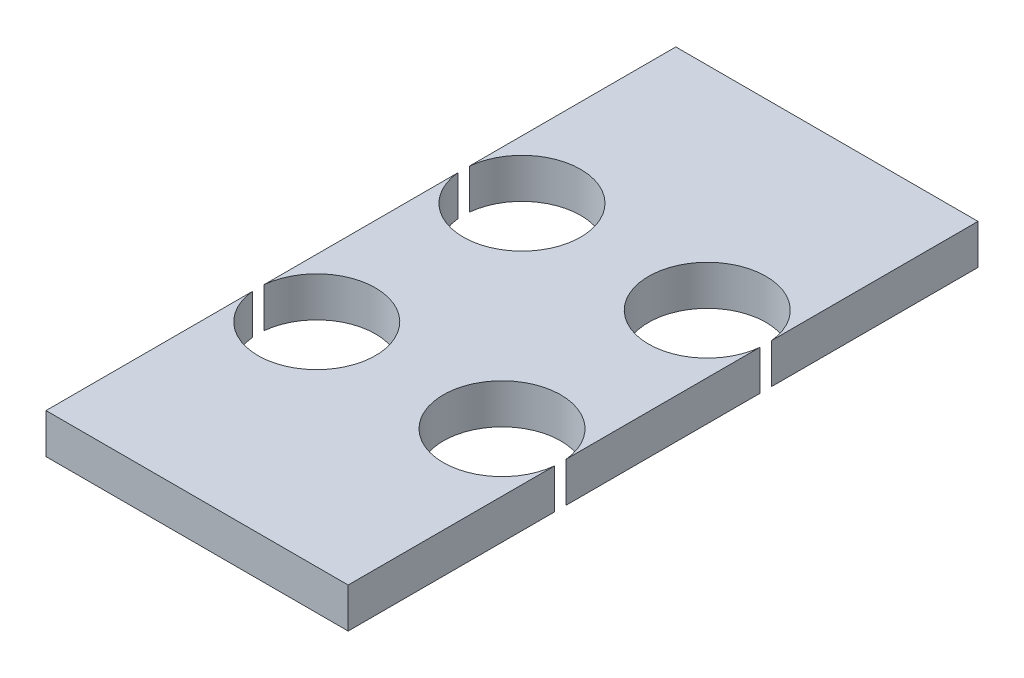
ISO-10303-21;
HEADER;
FILE_DESCRIPTION(('STEP AP214'),'2;1');
FILE_NAME('part.step','',(''),(''),'','','');
FILE_SCHEMA(('AUTOMOTIVE_DESIGN { 1 0 10303 214 1 1 1 1 }'));
ENDSEC;
DATA;
#1=APPLICATION_CONTEXT('core data for automotive mechanical design processes');
#2=APPLICATION_PROTOCOL_DEFINITION('international standard','automotive_design',2000,#1);
#3=PRODUCT_CONTEXT('',#1,'mechanical');
#4=PRODUCT('Part','Part','',(#3));
#5=PRODUCT_RELATED_PRODUCT_CATEGORY('part','',(#4));
#6=PRODUCT_DEFINITION_FORMATION('','',#4);
#7=PRODUCT_DEFINITION_CONTEXT('part definition',#1,'design');
#8=PRODUCT_DEFINITION('design','',#6,#7);
#9=PRODUCT_DEFINITION_SHAPE('','',#8);
#10=(LENGTH_UNIT() NAMED_UNIT(*) SI_UNIT(.MILLI.,.METRE.));
#11=(NAMED_UNIT(*) PLANE_ANGLE_UNIT() SI_UNIT($,.RADIAN.));
#12=(NAMED_UNIT(*) SI_UNIT($,.STERADIAN.) SOLID_ANGLE_UNIT());
#13=UNCERTAINTY_MEASURE_WITH_UNIT(LENGTH_MEASURE(1.E-05),#10,'distance_accuracy_value','');
#14=(GEOMETRIC_REPRESENTATION_CONTEXT(3) GLOBAL_UNCERTAINTY_ASSIGNED_CONTEXT((#13)) GLOBAL_UNIT_ASSIGNED_CONTEXT((#10,
#11,#12)) REPRESENTATION_CONTEXT('',''));
#15=CARTESIAN_POINT('',(0.,0.,0.));
#16=DIRECTION('',(0.,0.,1.));
#17=DIRECTION('',(1.,0.,0.));
#18=AXIS2_PLACEMENT_3D('',#15,#16,#17);
#19=CARTESIAN_POINT('',(26.5000000000005,43.5,109.385729063667));
#20=DIRECTION('',(-1.,0.,0.));
#21=DIRECTION('',(0.,-1.,0.));
#22=AXIS2_PLACEMENT_3D('',#19,#20,#21);
#23=PLANE('',#22);
#24=DIRECTION('',(0.,0.,-1.));
#25=VECTOR('',#24,1.);
#26=CARTESIAN_POINT('',(26.5000000000005,43.5,109.385729063667));
#27=LINE('',#26,#25);
#28=CARTESIAN_POINT('',(26.5000000000005,43.5,16.9863432533518));
#29=VERTEX_POINT('',#28);
#30=CARTESIAN_POINT('',(26.5000000000005,43.5,-16.9863432533754));
#31=VERTEX_POINT('',#30);
#32=EDGE_CURVE('E211',#29,#31,#27,.T.);
#33=ORIENTED_EDGE('',*,*,#32,.F.);
#34=DIRECTION('',(0.,-1.,0.));
#35=VECTOR('',#34,1.);
#36=CARTESIAN_POINT('',(26.5000000000005,88.001,16.9863432533518));
#37=LINE('',#36,#35);
#38=CARTESIAN_POINT('',(26.5000000000005,36.5,16.9863432533518));
#39=VERTEX_POINT('',#38);
#40=EDGE_CURVE('E182',#29,#39,#37,.T.);
#41=ORIENTED_EDGE('',*,*,#40,.T.);
#42=DIRECTION('',(0.,0.,1.));
#43=VECTOR('',#42,1.);
#44=CARTESIAN_POINT('',(26.5000000000005,36.5,-16.9863432533758));
#45=LINE('',#44,#43);
#46=CARTESIAN_POINT('',(26.5000000000005,36.5,-16.9863432533758));
#47=VERTEX_POINT('',#46);
#48=EDGE_CURVE('E169',#47,#39,#45,.T.);
#49=ORIENTED_EDGE('',*,*,#48,.F.);
#50=DIRECTION('',(0.,-1.,0.));
#51=VECTOR('',#50,1.);
#52=CARTESIAN_POINT('',(26.5000000000005,88.001,-16.9863432533759));
#53=LINE('',#52,#51);
#54=EDGE_CURVE('E190',#31,#47,#53,.T.);
#55=ORIENTED_EDGE('',*,*,#54,.F.);
#56=EDGE_LOOP('',(#33,#41,#49,#55));
#57=FACE_BOUND('',#56,.T.);
#58=ADVANCED_FACE('F36',(#57),#23,.F.);
#59=CARTESIAN_POINT('',(26.5000000000005,43.5,-19.0136567466377));
#60=VERTEX_POINT('',#59);
#61=CARTESIAN_POINT('',(26.5000000000005,43.5,-55.2350000000062));
#62=VERTEX_POINT('',#61);
#63=EDGE_CURVE('E207',#60,#62,#27,.T.);
#64=ORIENTED_EDGE('',*,*,#63,.F.);
#65=DIRECTION('',(0.,-1.,0.));
#66=VECTOR('',#65,1.);
#67=CARTESIAN_POINT('',(26.5000000000005,88.001,-19.0136567466377));
#68=LINE('',#67,#66);
#69=CARTESIAN_POINT('',(26.5000000000005,36.5,-19.0136567466377));
#70=VERTEX_POINT('',#69);
#71=EDGE_CURVE('E188',#60,#70,#68,.T.);
#72=ORIENTED_EDGE('',*,*,#71,.T.);
#73=DIRECTION('',(0.,0.,1.));
#74=VECTOR('',#73,1.);
#75=CARTESIAN_POINT('',(26.5000000000005,36.5,-55.2350000000062));
#76=LINE('',#75,#74);
#77=CARTESIAN_POINT('',(26.5000000000005,36.5,-55.2350000000062));
#78=VERTEX_POINT('',#77);
#79=EDGE_CURVE('E163',#78,#70,#76,.T.);
#80=ORIENTED_EDGE('',*,*,#79,.F.);
#81=DIRECTION('',(0.,1.,0.));
#82=VECTOR('',#81,1.);
#83=CARTESIAN_POINT('',(26.5000000000005,43.5,-55.2350000000062));
#84=LINE('',#83,#82);
#85=EDGE_CURVE('E199',#78,#62,#84,.T.);
#86=ORIENTED_EDGE('',*,*,#85,.T.);
#87=EDGE_LOOP('',(#64,#72,#80,#86));
#88=FACE_BOUND('',#87,.T.);
#89=ADVANCED_FACE('F225',(#88),#23,.F.);
#90=CARTESIAN_POINT('',(-26.4999999999995,43.5,109.385729063667));
#91=DIRECTION('',(1.,0.,0.));
#92=DIRECTION('',(0.,0.,-1.));
#93=AXIS2_PLACEMENT_3D('',#90,#91,#92);
#94=PLANE('',#93);
#95=DIRECTION('',(0.,0.,-1.));
#96=VECTOR('',#95,1.);
#97=CARTESIAN_POINT('',(-26.4999999999995,43.5,109.385729063667));
#98=LINE('',#97,#96);
#99=CARTESIAN_POINT('',(-26.4999999999995,43.5,55.234999999994));
#100=VERTEX_POINT('',#99);
#101=CARTESIAN_POINT('',(-26.4999999999995,43.5,19.0136567466416));
#102=VERTEX_POINT('',#101);
#103=EDGE_CURVE('E206',#100,#102,#98,.T.);
#104=ORIENTED_EDGE('',*,*,#103,.T.);
#105=DIRECTION('',(0.,-1.,0.));
#106=VECTOR('',#105,1.);
#107=CARTESIAN_POINT('',(-26.4999999999995,88.001,19.0136567466416));
#108=LINE('',#107,#106);
#109=CARTESIAN_POINT('',(-26.4999999999995,36.5,19.0136567466416));
#110=VERTEX_POINT('',#109);
#111=EDGE_CURVE('E137',#102,#110,#108,.T.);
#112=ORIENTED_EDGE('',*,*,#111,.T.);
#113=DIRECTION('',(0.,0.,-1.));
#114=VECTOR('',#113,1.);
#115=CARTESIAN_POINT('',(-26.4999999999995,36.5,55.234999999994));
#116=LINE('',#115,#114);
#117=CARTESIAN_POINT('',(-26.4999999999995,36.5,55.234999999994));
#118=VERTEX_POINT('',#117);
#119=EDGE_CURVE('E135',#118,#110,#116,.T.);
#120=ORIENTED_EDGE('',*,*,#119,.F.);
#121=DIRECTION('',(0.,1.,0.));
#122=VECTOR('',#121,1.);
#123=CARTESIAN_POINT('',(-26.4999999999995,43.5,55.234999999994));
#124=LINE('',#123,#122);
#125=EDGE_CURVE('E12',#118,#100,#124,.T.);
#126=ORIENTED_EDGE('',*,*,#125,.T.);
#127=EDGE_LOOP('',(#104,#112,#120,#126));
#128=FACE_BOUND('',#127,.T.);
#129=ADVANCED_FACE('F136',(#128),#94,.F.);
#130=DIRECTION('',(0.,-1.,0.));
#131=VECTOR('',#130,1.);
#132=CARTESIAN_POINT('',(-26.4999999999995,88.001,-16.9863432533593));
#133=LINE('',#132,#131);
#134=CARTESIAN_POINT('',(-26.4999999999995,43.5,-16.9863432533593));
#135=VERTEX_POINT('',#134);
#136=CARTESIAN_POINT('',(-26.4999999999995,36.5,-16.9863432533593));
#137=VERTEX_POINT('',#136);
#138=EDGE_CURVE('E193',#135,#137,#133,.T.);
#139=ORIENTED_EDGE('',*,*,#138,.T.);
#140=DIRECTION('',(0.,0.,-1.));
#141=VECTOR('',#140,1.);
#142=CARTESIAN_POINT('',(-26.4999999999995,36.5,16.9863432533585));
#143=LINE('',#142,#141);
#144=CARTESIAN_POINT('',(-26.4999999999995,36.5,16.9863432533585));
#145=VERTEX_POINT('',#144);
#146=EDGE_CURVE('E151',#145,#137,#143,.T.);
#147=ORIENTED_EDGE('',*,*,#146,.F.);
#148=DIRECTION('',(0.,-1.,0.));
#149=VECTOR('',#148,1.);
#150=CARTESIAN_POINT('',(-26.4999999999995,88.001,16.9863432533585));
#151=LINE('',#150,#149);
#152=CARTESIAN_POINT('',(-26.4999999999995,43.5,16.9863432533585));
#153=VERTEX_POINT('',#152);
#154=EDGE_CURVE('E177',#153,#145,#151,.T.);
#155=ORIENTED_EDGE('',*,*,#154,.F.);
#156=EDGE_CURVE('E208',#153,#135,#98,.T.);
#157=ORIENTED_EDGE('',*,*,#156,.T.);
#158=EDGE_LOOP('',(#139,#147,#155,#157));
#159=FACE_BOUND('',#158,.T.);
#160=ADVANCED_FACE('F236',(#159),#94,.F.);
#161=CARTESIAN_POINT('',(0.,0.,-55.2350000000062));
#162=DIRECTION('',(0.,0.,1.));
#163=DIRECTION('',(1.,0.,0.));
#164=AXIS2_PLACEMENT_3D('',#161,#162,#163);
#165=PLANE('',#164);
#166=DIRECTION('',(0.,-1.,0.));
#167=VECTOR('',#166,1.);
#168=CARTESIAN_POINT('',(-26.4999999999995,43.5,-55.2350000000062));
#169=LINE('',#168,#167);
#170=CARTESIAN_POINT('',(-26.4999999999995,43.5,-55.2350000000062));
#171=VERTEX_POINT('',#170);
#172=CARTESIAN_POINT('',(-26.4999999999995,36.5,-55.2350000000062));
#173=VERTEX_POINT('',#172);
#174=EDGE_CURVE('E181',#171,#173,#169,.T.);
#175=ORIENTED_EDGE('',*,*,#174,.F.);
#176=DIRECTION('',(-1.,0.,0.));
#177=VECTOR('',#176,1.);
#178=CARTESIAN_POINT('',(-26.4999999999995,43.5,-55.2350000000062));
#179=LINE('',#178,#177);
#180=EDGE_CURVE('E202',#62,#171,#179,.T.);
#181=ORIENTED_EDGE('',*,*,#180,.F.);
#182=ORIENTED_EDGE('',*,*,#85,.F.);
#183=DIRECTION('',(1.,0.,0.));
#184=VECTOR('',#183,1.);
#185=CARTESIAN_POINT('',(-26.4999999999995,36.5,-55.2350000000062));
#186=LINE('',#185,#184);
#187=EDGE_CURVE('E160',#173,#78,#186,.T.);
#188=ORIENTED_EDGE('',*,*,#187,.F.);
#189=EDGE_LOOP('',(#175,#181,#182,#188));
#190=FACE_BOUND('',#189,.T.);
#191=ADVANCED_FACE('F228',(#190),#165,.F.);
#192=CARTESIAN_POINT('',(-26.4999999999995,43.5,109.385729063667));
#193=DIRECTION('',(0.,-1.,0.));
#194=DIRECTION('',(1.,0.,0.));
#195=AXIS2_PLACEMENT_3D('',#192,#193,#194);
#196=PLANE('',#195);
#197=ORIENTED_EDGE('',*,*,#156,.F.);
#198=CARTESIAN_POINT('',(-16.2500000000001,43.5,18.0000000000001));
#199=DIRECTION('',(0.,-1.,0.));
#200=DIRECTION('',(1.,0.,0.));
#201=AXIS2_PLACEMENT_3D('',#198,#199,#200);
#202=CIRCLE('',#201,10.3);
#203=EDGE_CURVE('E61',#102,#153,#202,.F.);
#204=ORIENTED_EDGE('',*,*,#203,.F.);
#205=ORIENTED_EDGE('',*,*,#103,.F.);
#206=DIRECTION('',(1.,0.,0.));
#207=VECTOR('',#206,1.);
#208=CARTESIAN_POINT('',(-26.4999999999995,43.5,55.234999999994));
#209=LINE('',#208,#207);
#210=CARTESIAN_POINT('',(26.5000000000005,43.5,55.234999999994));
#211=VERTEX_POINT('',#210);
#212=EDGE_CURVE('E40',#100,#211,#209,.T.);
#213=ORIENTED_EDGE('',*,*,#212,.T.);
#214=CARTESIAN_POINT('',(26.5000000000005,43.5,19.0136567466337));
#215=VERTEX_POINT('',#214);
#216=EDGE_CURVE('E209',#211,#215,#27,.T.);
#217=ORIENTED_EDGE('',*,*,#216,.T.);
#218=CARTESIAN_POINT('',(16.2500000000009,43.5,17.9999999999925));
#219=DIRECTION('',(0.,-1.,0.));
#220=DIRECTION('',(1.,0.,0.));
#221=AXIS2_PLACEMENT_3D('',#218,#219,#220);
#222=CIRCLE('',#221,10.3);
#223=EDGE_CURVE('E179',#29,#215,#222,.F.);
#224=ORIENTED_EDGE('',*,*,#223,.F.);
#225=ORIENTED_EDGE('',*,*,#32,.T.);
#226=CARTESIAN_POINT('',(16.25,43.5,-18.0000000000068));
#227=DIRECTION('',(0.,-1.,0.));
#228=DIRECTION('',(1.,0.,0.));
#229=AXIS2_PLACEMENT_3D('',#226,#227,#228);
#230=CIRCLE('',#229,10.3);
#231=EDGE_CURVE('E186',#60,#31,#230,.F.);
#232=ORIENTED_EDGE('',*,*,#231,.F.);
#233=ORIENTED_EDGE('',*,*,#63,.T.);
#234=ORIENTED_EDGE('',*,*,#180,.T.);
#235=CARTESIAN_POINT('',(-26.4999999999995,43.5,-19.0136567466406));
#236=VERTEX_POINT('',#235);
#237=EDGE_CURVE('E205',#236,#171,#98,.T.);
#238=ORIENTED_EDGE('',*,*,#237,.F.);
#239=CARTESIAN_POINT('',(-16.25,43.5,-18.));
#240=DIRECTION('',(0.,-1.,0.));
#241=DIRECTION('',(1.,0.,0.));
#242=AXIS2_PLACEMENT_3D('',#239,#240,#241);
#243=CIRCLE('',#242,10.3);
#244=EDGE_CURVE('E53',#135,#236,#243,.F.);
#245=ORIENTED_EDGE('',*,*,#244,.F.);
#246=EDGE_LOOP('',(#197,#204,#205,#213,#217,#224,#225,#232,#233,#234,#238,#245));
#247=FACE_BOUND('',#246,.T.);
#248=ADVANCED_FACE('F219',(#247),#196,.F.);
#249=DIRECTION('',(0.,-1.,0.));
#250=VECTOR('',#249,1.);
#251=CARTESIAN_POINT('',(26.5000000000005,43.5,55.234999999994));
#252=LINE('',#251,#250);
#253=CARTESIAN_POINT('',(26.5000000000005,36.5,55.234999999994));
#254=VERTEX_POINT('',#253);
#255=EDGE_CURVE('E45',#211,#254,#252,.T.);
#256=ORIENTED_EDGE('',*,*,#255,.T.);
#257=DIRECTION('',(0.,0.,1.));
#258=VECTOR('',#257,1.);
#259=CARTESIAN_POINT('',(26.5000000000005,36.5,19.0136567466332));
#260=LINE('',#259,#258);
#261=CARTESIAN_POINT('',(26.5000000000005,36.5,19.0136567466332));
#262=VERTEX_POINT('',#261);
#263=EDGE_CURVE('E147',#262,#254,#260,.T.);
#264=ORIENTED_EDGE('',*,*,#263,.F.);
#265=DIRECTION('',(0.,-1.,0.));
#266=VECTOR('',#265,1.);
#267=CARTESIAN_POINT('',(26.5000000000005,88.001,19.0136567466332));
#268=LINE('',#267,#266);
#269=EDGE_CURVE('E184',#215,#262,#268,.T.);
#270=ORIENTED_EDGE('',*,*,#269,.F.);
#271=ORIENTED_EDGE('',*,*,#216,.F.);
#272=EDGE_LOOP('',(#256,#264,#270,#271));
#273=FACE_BOUND('',#272,.T.);
#274=ADVANCED_FACE('F253',(#273),#23,.F.);
#275=ORIENTED_EDGE('',*,*,#174,.T.);
#276=DIRECTION('',(0.,0.,-1.));
#277=VECTOR('',#276,1.);
#278=CARTESIAN_POINT('',(-26.4999999999995,36.5,-19.0136567466407));
#279=LINE('',#278,#277);
#280=CARTESIAN_POINT('',(-26.4999999999995,36.5,-19.0136567466407));
#281=VERTEX_POINT('',#280);
#282=EDGE_CURVE('E157',#281,#173,#279,.T.);
#283=ORIENTED_EDGE('',*,*,#282,.F.);
#284=DIRECTION('',(0.,-1.,0.));
#285=VECTOR('',#284,1.);
#286=CARTESIAN_POINT('',(-26.4999999999995,88.001,-19.0136567466407));
#287=LINE('',#286,#285);
#288=EDGE_CURVE('E175',#236,#281,#287,.T.);
#289=ORIENTED_EDGE('',*,*,#288,.F.);
#290=ORIENTED_EDGE('',*,*,#237,.T.);
#291=EDGE_LOOP('',(#275,#283,#289,#290));
#292=FACE_BOUND('',#291,.T.);
#293=ADVANCED_FACE('F38',(#292),#94,.F.);
#294=CARTESIAN_POINT('',(-27.4999999999995,39.5,55.234999999994));
#295=DIRECTION('',(0.,0.,-1.));
#296=DIRECTION('',(-1.,0.,0.));
#297=AXIS2_PLACEMENT_3D('',#294,#295,#296);
#298=PLANE('',#297);
#299=ORIENTED_EDGE('',*,*,#125,.F.);
#300=DIRECTION('',(-1.,0.,0.));
#301=VECTOR('',#300,1.);
#302=CARTESIAN_POINT('',(26.5000000000005,36.5,55.234999999994));
#303=LINE('',#302,#301);
#304=EDGE_CURVE('E129',#254,#118,#303,.T.);
#305=ORIENTED_EDGE('',*,*,#304,.F.);
#306=ORIENTED_EDGE('',*,*,#255,.F.);
#307=ORIENTED_EDGE('',*,*,#212,.F.);
#308=EDGE_LOOP('',(#299,#305,#306,#307));
#309=FACE_BOUND('',#308,.T.);
#310=ADVANCED_FACE('F127',(#309),#298,.F.);
#311=CARTESIAN_POINT('',(-16.25,88.001,-18.));
#312=DIRECTION('',(0.,-1.,0.));
#313=DIRECTION('',(0.,0.,-1.));
#314=AXIS2_PLACEMENT_3D('',#311,#312,#313);
#315=CYLINDRICAL_SURFACE('',#314,10.3);
#316=ORIENTED_EDGE('',*,*,#244,.T.);
#317=ORIENTED_EDGE('',*,*,#288,.T.);
#318=CARTESIAN_POINT('',(-16.25,36.5,-18.));
#319=DIRECTION('',(0.,1.,0.));
#320=DIRECTION('',(0.,0.,-1.));
#321=AXIS2_PLACEMENT_3D('',#318,#319,#320);
#322=CIRCLE('',#321,10.3);
#323=EDGE_CURVE('E154',#137,#281,#322,.T.);
#324=ORIENTED_EDGE('',*,*,#323,.F.);
#325=ORIENTED_EDGE('',*,*,#138,.F.);
#326=EDGE_LOOP('',(#316,#317,#324,#325));
#327=FACE_BOUND('',#326,.T.);
#328=ADVANCED_FACE('F233',(#327),#315,.F.);
#329=CARTESIAN_POINT('',(-16.2500000000001,88.001,18.0000000000001));
#330=DIRECTION('',(0.,-1.,0.));
#331=DIRECTION('',(0.,0.,-1.));
#332=AXIS2_PLACEMENT_3D('',#329,#330,#331);
#333=CYLINDRICAL_SURFACE('',#332,10.3);
#334=ORIENTED_EDGE('',*,*,#203,.T.);
#335=ORIENTED_EDGE('',*,*,#154,.T.);
#336=CARTESIAN_POINT('',(-16.2500000000001,36.5,18.0000000000001));
#337=DIRECTION('',(0.,1.,0.));
#338=DIRECTION('',(0.,0.,-1.));
#339=AXIS2_PLACEMENT_3D('',#336,#337,#338);
#340=CIRCLE('',#339,10.3);
#341=EDGE_CURVE('E141',#110,#145,#340,.T.);
#342=ORIENTED_EDGE('',*,*,#341,.F.);
#343=ORIENTED_EDGE('',*,*,#111,.F.);
#344=EDGE_LOOP('',(#334,#335,#342,#343));
#345=FACE_BOUND('',#344,.T.);
#346=ADVANCED_FACE('F237',(#345),#333,.F.);
#347=CARTESIAN_POINT('',(16.25,88.001,-18.0000000000068));
#348=DIRECTION('',(0.,-1.,0.));
#349=DIRECTION('',(0.,0.,-1.));
#350=AXIS2_PLACEMENT_3D('',#347,#348,#349);
#351=CYLINDRICAL_SURFACE('',#350,10.3);
#352=ORIENTED_EDGE('',*,*,#231,.T.);
#353=ORIENTED_EDGE('',*,*,#54,.T.);
#354=CARTESIAN_POINT('',(16.25,36.5,-18.0000000000068));
#355=DIRECTION('',(0.,1.,0.));
#356=DIRECTION('',(0.,0.,-1.));
#357=AXIS2_PLACEMENT_3D('',#354,#355,#356);
#358=CIRCLE('',#357,10.3);
#359=EDGE_CURVE('E166',#70,#47,#358,.T.);
#360=ORIENTED_EDGE('',*,*,#359,.F.);
#361=ORIENTED_EDGE('',*,*,#71,.F.);
#362=EDGE_LOOP('',(#352,#353,#360,#361));
#363=FACE_BOUND('',#362,.T.);
#364=ADVANCED_FACE('F239',(#363),#351,.F.);
#365=CARTESIAN_POINT('',(16.2500000000009,88.001,17.9999999999925));
#366=DIRECTION('',(0.,-1.,0.));
#367=DIRECTION('',(0.,0.,-1.));
#368=AXIS2_PLACEMENT_3D('',#365,#366,#367);
#369=CYLINDRICAL_SURFACE('',#368,10.3);
#370=ORIENTED_EDGE('',*,*,#223,.T.);
#371=ORIENTED_EDGE('',*,*,#269,.T.);
#372=CARTESIAN_POINT('',(16.2500000000009,36.5,17.9999999999925));
#373=DIRECTION('',(0.,1.,0.));
#374=DIRECTION('',(0.,0.,-1.));
#375=AXIS2_PLACEMENT_3D('',#372,#373,#374);
#376=CIRCLE('',#375,10.3);
#377=EDGE_CURVE('E172',#39,#262,#376,.T.);
#378=ORIENTED_EDGE('',*,*,#377,.F.);
#379=ORIENTED_EDGE('',*,*,#40,.F.);
#380=EDGE_LOOP('',(#370,#371,#378,#379));
#381=FACE_BOUND('',#380,.T.);
#382=ADVANCED_FACE('F245',(#381),#369,.F.);
#383=CARTESIAN_POINT('',(-16.2500000000001,36.5,18.0000000000001));
#384=DIRECTION('',(0.,-1.,0.));
#385=DIRECTION('',(0.,0.,-1.));
#386=AXIS2_PLACEMENT_3D('',#383,#384,#385);
#387=PLANE('',#386);
#388=ORIENTED_EDGE('',*,*,#304,.T.);
#389=ORIENTED_EDGE('',*,*,#119,.T.);
#390=ORIENTED_EDGE('',*,*,#341,.T.);
#391=ORIENTED_EDGE('',*,*,#146,.T.);
#392=ORIENTED_EDGE('',*,*,#323,.T.);
#393=ORIENTED_EDGE('',*,*,#282,.T.);
#394=ORIENTED_EDGE('',*,*,#187,.T.);
#395=ORIENTED_EDGE('',*,*,#79,.T.);
#396=ORIENTED_EDGE('',*,*,#359,.T.);
#397=ORIENTED_EDGE('',*,*,#48,.T.);
#398=ORIENTED_EDGE('',*,*,#377,.T.);
#399=ORIENTED_EDGE('',*,*,#263,.T.);
#400=EDGE_LOOP('',(#388,#389,#390,#391,#392,#393,#394,#395,#396,#397,#398,#399));
#401=FACE_BOUND('',#400,.T.);
#402=ADVANCED_FACE('F144',(#401),#387,.T.);
#403=CLOSED_SHELL('',(#58,#89,#129,#160,#191,#248,#274,#293,#310,#328,#346,#364,#382,#402));
#404=MANIFOLD_SOLID_BREP('B2',#403);
#405=ADVANCED_BREP_SHAPE_REPRESENTATION('',(#18,#404),#14);
#406=SHAPE_DEFINITION_REPRESENTATION(#9,#405);
ENDSEC;
END-ISO-10303-21;
